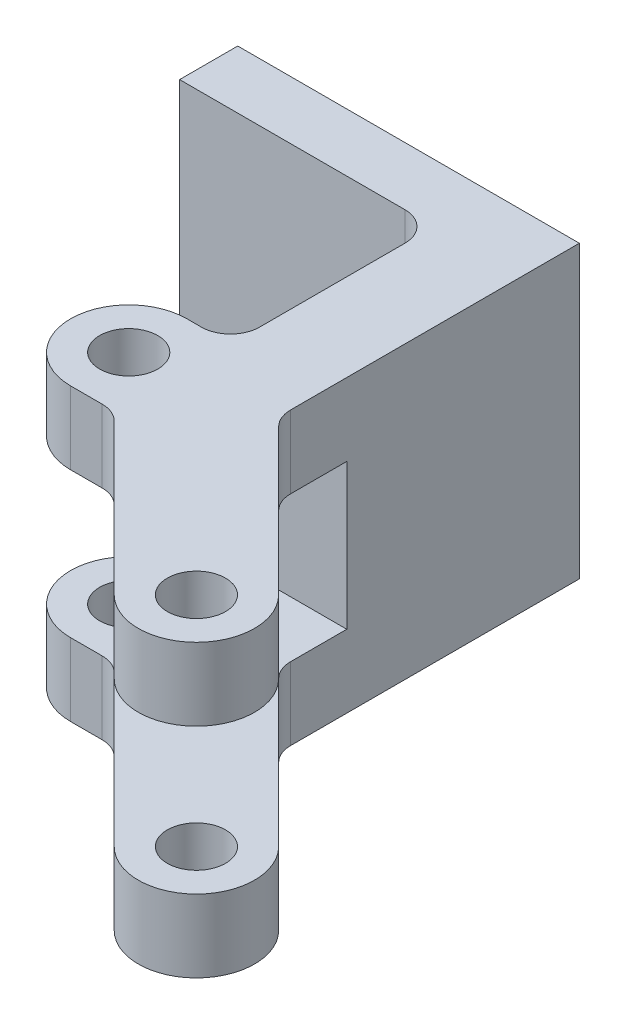
ISO-10303-21;
HEADER;
FILE_DESCRIPTION(('STEP AP214'),'2;1');
FILE_NAME('part.step','',(''),(''),'','','');
FILE_SCHEMA(('AUTOMOTIVE_DESIGN { 1 0 10303 214 1 1 1 1 }'));
ENDSEC;
DATA;
#1=APPLICATION_CONTEXT('core data for automotive mechanical design processes');
#2=APPLICATION_PROTOCOL_DEFINITION('international standard','automotive_design',2000,#1);
#3=PRODUCT_CONTEXT('',#1,'mechanical');
#4=PRODUCT('Part','Part','',(#3));
#5=PRODUCT_RELATED_PRODUCT_CATEGORY('part','',(#4));
#6=PRODUCT_DEFINITION_FORMATION('','',#4);
#7=PRODUCT_DEFINITION_CONTEXT('part definition',#1,'design');
#8=PRODUCT_DEFINITION('design','',#6,#7);
#9=PRODUCT_DEFINITION_SHAPE('','',#8);
#10=(LENGTH_UNIT() NAMED_UNIT(*) SI_UNIT(.MILLI.,.METRE.));
#11=(NAMED_UNIT(*) PLANE_ANGLE_UNIT() SI_UNIT($,.RADIAN.));
#12=(NAMED_UNIT(*) SI_UNIT($,.STERADIAN.) SOLID_ANGLE_UNIT());
#13=UNCERTAINTY_MEASURE_WITH_UNIT(LENGTH_MEASURE(1.E-05),#10,'distance_accuracy_value','');
#14=(GEOMETRIC_REPRESENTATION_CONTEXT(3) GLOBAL_UNCERTAINTY_ASSIGNED_CONTEXT((#13)) GLOBAL_UNIT_ASSIGNED_CONTEXT((#10,
#11,#12)) REPRESENTATION_CONTEXT('',''));
#15=CARTESIAN_POINT('',(0.,0.,0.));
#16=DIRECTION('',(0.,0.,1.));
#17=DIRECTION('',(1.,0.,0.));
#18=AXIS2_PLACEMENT_3D('',#15,#16,#17);
#19=CARTESIAN_POINT('',(0.,10.,4.));
#20=DIRECTION('',(1.,0.,0.));
#21=DIRECTION('',(0.,0.,-1.));
#22=AXIS2_PLACEMENT_3D('',#19,#20,#21);
#23=PLANE('',#22);
#24=DIRECTION('',(0.,0.,1.));
#25=VECTOR('',#24,1.);
#26=CARTESIAN_POINT('',(0.,-10.,4.));
#27=LINE('',#26,#25);
#28=CARTESIAN_POINT('',(0.,-10.,-16.));
#29=VERTEX_POINT('',#28);
#30=CARTESIAN_POINT('',(0.,-10.,-6.));
#31=VERTEX_POINT('',#30);
#32=EDGE_CURVE('E213',#29,#31,#27,.T.);
#33=ORIENTED_EDGE('',*,*,#32,.T.);
#34=DIRECTION('',(0.,-1.,0.));
#35=VECTOR('',#34,1.);
#36=CARTESIAN_POINT('',(0.,-5.,-6.));
#37=LINE('',#36,#35);
#38=CARTESIAN_POINT('',(0.,-5.,-6.));
#39=VERTEX_POINT('',#38);
#40=EDGE_CURVE('E208',#31,#39,#37,.F.);
#41=ORIENTED_EDGE('',*,*,#40,.T.);
#42=DIRECTION('',(0.,1.,0.));
#43=VECTOR('',#42,1.);
#44=CARTESIAN_POINT('',(0.,10.,-6.));
#45=LINE('',#44,#43);
#46=CARTESIAN_POINT('',(0.,5.,-6.));
#47=VERTEX_POINT('',#46);
#48=EDGE_CURVE('E210',#39,#47,#45,.T.);
#49=ORIENTED_EDGE('',*,*,#48,.T.);
#50=DIRECTION('',(0.,-1.,0.));
#51=VECTOR('',#50,1.);
#52=CARTESIAN_POINT('',(0.,10.,-6.));
#53=LINE('',#52,#51);
#54=CARTESIAN_POINT('',(0.,10.,-6.));
#55=VERTEX_POINT('',#54);
#56=EDGE_CURVE('E217',#47,#55,#53,.F.);
#57=ORIENTED_EDGE('',*,*,#56,.T.);
#58=DIRECTION('',(0.,0.,1.));
#59=VECTOR('',#58,1.);
#60=CARTESIAN_POINT('',(0.,10.,4.));
#61=LINE('',#60,#59);
#62=CARTESIAN_POINT('',(0.,10.,-16.));
#63=VERTEX_POINT('',#62);
#64=EDGE_CURVE('E335',#63,#55,#61,.T.);
#65=ORIENTED_EDGE('',*,*,#64,.F.);
#66=DIRECTION('',(0.,-1.,0.));
#67=VECTOR('',#66,1.);
#68=CARTESIAN_POINT('',(0.,-10.,-16.));
#69=LINE('',#68,#67);
#70=EDGE_CURVE('E313',#63,#29,#69,.T.);
#71=ORIENTED_EDGE('',*,*,#70,.T.);
#72=EDGE_LOOP('',(#33,#41,#49,#57,#65,#71));
#73=FACE_BOUND('',#72,.T.);
#74=ADVANCED_FACE('F34',(#73),#23,.F.);
#75=CARTESIAN_POINT('',(0.,10.,4.));
#76=DIRECTION('',(0.,0.,-1.));
#77=DIRECTION('',(-1.,0.,0.));
#78=AXIS2_PLACEMENT_3D('',#75,#76,#77);
#79=PLANE('',#78);
#80=DIRECTION('',(-1.,0.,0.));
#81=VECTOR('',#80,1.);
#82=CARTESIAN_POINT('',(0.,5.,4.));
#83=LINE('',#82,#81);
#84=CARTESIAN_POINT('',(-0.82842712474619,5.,4.));
#85=VERTEX_POINT('',#84);
#86=CARTESIAN_POINT('',(-3.,5.,4.));
#87=VERTEX_POINT('',#86);
#88=EDGE_CURVE('E273',#85,#87,#83,.T.);
#89=ORIENTED_EDGE('',*,*,#88,.F.);
#90=DIRECTION('',(0.,1.,0.));
#91=VECTOR('',#90,1.);
#92=CARTESIAN_POINT('',(-0.82842712474619,10.,4.));
#93=LINE('',#92,#91);
#94=CARTESIAN_POINT('',(-0.82842712474619,10.,4.));
#95=VERTEX_POINT('',#94);
#96=EDGE_CURVE('E284',#85,#95,#93,.T.);
#97=ORIENTED_EDGE('',*,*,#96,.T.);
#98=DIRECTION('',(1.,0.,0.));
#99=VECTOR('',#98,1.);
#100=CARTESIAN_POINT('',(0.,10.,4.));
#101=LINE('',#100,#99);
#102=CARTESIAN_POINT('',(-3.,10.,4.));
#103=VERTEX_POINT('',#102);
#104=EDGE_CURVE('E337',#103,#95,#101,.T.);
#105=ORIENTED_EDGE('',*,*,#104,.F.);
#106=DIRECTION('',(0.,-1.,0.));
#107=VECTOR('',#106,1.);
#108=CARTESIAN_POINT('',(-3.,10.,4.));
#109=LINE('',#108,#107);
#110=EDGE_CURVE('E287',#103,#87,#109,.T.);
#111=ORIENTED_EDGE('',*,*,#110,.T.);
#112=EDGE_LOOP('',(#89,#97,#105,#111));
#113=FACE_BOUND('',#112,.T.);
#114=ADVANCED_FACE('F283',(#113),#79,.F.);
#115=DIRECTION('',(1.,0.,0.));
#116=VECTOR('',#115,1.);
#117=CARTESIAN_POINT('',(0.,-10.,4.));
#118=LINE('',#117,#116);
#119=CARTESIAN_POINT('',(-3.,-10.,4.));
#120=VERTEX_POINT('',#119);
#121=CARTESIAN_POINT('',(-0.82842712474619,-10.,4.));
#122=VERTEX_POINT('',#121);
#123=EDGE_CURVE('E346',#120,#122,#118,.T.);
#124=ORIENTED_EDGE('',*,*,#123,.T.);
#125=DIRECTION('',(0.,1.,0.));
#126=VECTOR('',#125,1.);
#127=CARTESIAN_POINT('',(-0.82842712474619,10.,4.));
#128=LINE('',#127,#126);
#129=CARTESIAN_POINT('',(-0.82842712474619,-5.,4.));
#130=VERTEX_POINT('',#129);
#131=EDGE_CURVE('E295',#122,#130,#128,.T.);
#132=ORIENTED_EDGE('',*,*,#131,.T.);
#133=DIRECTION('',(1.,0.,0.));
#134=VECTOR('',#133,1.);
#135=CARTESIAN_POINT('',(0.,-5.,4.));
#136=LINE('',#135,#134);
#137=CARTESIAN_POINT('',(-3.,-5.,4.));
#138=VERTEX_POINT('',#137);
#139=EDGE_CURVE('E430',#138,#130,#136,.T.);
#140=ORIENTED_EDGE('',*,*,#139,.F.);
#141=EDGE_CURVE('E361',#138,#120,#109,.T.);
#142=ORIENTED_EDGE('',*,*,#141,.T.);
#143=EDGE_LOOP('',(#124,#132,#140,#142));
#144=FACE_BOUND('',#143,.T.);
#145=ADVANCED_FACE('F492',(#144),#79,.F.);
#146=CARTESIAN_POINT('',(6.,10.,-22.));
#147=DIRECTION('',(-1.,0.,0.));
#148=DIRECTION('',(0.,0.,1.));
#149=AXIS2_PLACEMENT_3D('',#146,#147,#148);
#150=PLANE('',#149);
#151=DIRECTION('',(0.,0.,-1.));
#152=VECTOR('',#151,1.);
#153=CARTESIAN_POINT('',(6.,10.,-22.));
#154=LINE('',#153,#152);
#155=CARTESIAN_POINT('',(6.,10.,-2.14213562373096));
#156=VERTEX_POINT('',#155);
#157=CARTESIAN_POINT('',(6.,10.,-22.));
#158=VERTEX_POINT('',#157);
#159=EDGE_CURVE('E357',#156,#158,#154,.T.);
#160=ORIENTED_EDGE('',*,*,#159,.F.);
#161=DIRECTION('',(0.,1.,0.));
#162=VECTOR('',#161,1.);
#163=CARTESIAN_POINT('',(6.,10.,-2.14213562373095));
#164=LINE('',#163,#162);
#165=CARTESIAN_POINT('',(6.,5.,-2.14213562373095));
#166=VERTEX_POINT('',#165);
#167=EDGE_CURVE('E303',#156,#166,#164,.F.);
#168=ORIENTED_EDGE('',*,*,#167,.T.);
#169=DIRECTION('',(0.,0.,1.));
#170=VECTOR('',#169,1.);
#171=CARTESIAN_POINT('',(6.,5.,-22.));
#172=LINE('',#171,#170);
#173=CARTESIAN_POINT('',(6.,5.,-6.));
#174=VERTEX_POINT('',#173);
#175=EDGE_CURVE('E418',#174,#166,#172,.T.);
#176=ORIENTED_EDGE('',*,*,#175,.F.);
#177=DIRECTION('',(0.,-1.,0.));
#178=VECTOR('',#177,1.);
#179=CARTESIAN_POINT('',(6.,10.,-6.));
#180=LINE('',#179,#178);
#181=CARTESIAN_POINT('',(6.,-5.,-6.));
#182=VERTEX_POINT('',#181);
#183=EDGE_CURVE('E316',#174,#182,#180,.T.);
#184=ORIENTED_EDGE('',*,*,#183,.T.);
#185=DIRECTION('',(0.,0.,-1.));
#186=VECTOR('',#185,1.);
#187=CARTESIAN_POINT('',(6.,-5.,-22.));
#188=LINE('',#187,#186);
#189=CARTESIAN_POINT('',(6.,-5.,-2.14213562373095));
#190=VERTEX_POINT('',#189);
#191=EDGE_CURVE('E236',#190,#182,#188,.T.);
#192=ORIENTED_EDGE('',*,*,#191,.F.);
#193=DIRECTION('',(0.,1.,0.));
#194=VECTOR('',#193,1.);
#195=CARTESIAN_POINT('',(6.,10.,-2.14213562373095));
#196=LINE('',#195,#194);
#197=CARTESIAN_POINT('',(6.,-10.,-2.14213562373096));
#198=VERTEX_POINT('',#197);
#199=EDGE_CURVE('E305',#190,#198,#196,.F.);
#200=ORIENTED_EDGE('',*,*,#199,.T.);
#201=DIRECTION('',(0.,0.,-1.));
#202=VECTOR('',#201,1.);
#203=CARTESIAN_POINT('',(6.,-10.,-22.));
#204=LINE('',#203,#202);
#205=CARTESIAN_POINT('',(6.,-10.,-22.));
#206=VERTEX_POINT('',#205);
#207=EDGE_CURVE('E344',#198,#206,#204,.T.);
#208=ORIENTED_EDGE('',*,*,#207,.T.);
#209=DIRECTION('',(0.,-1.,0.));
#210=VECTOR('',#209,1.);
#211=CARTESIAN_POINT('',(6.,10.,-22.));
#212=LINE('',#211,#210);
#213=EDGE_CURVE('E318',#158,#206,#212,.T.);
#214=ORIENTED_EDGE('',*,*,#213,.F.);
#215=EDGE_LOOP('',(#160,#168,#176,#184,#192,#200,#208,#214));
#216=FACE_BOUND('',#215,.T.);
#217=ADVANCED_FACE('F462',(#216),#150,.F.);
#218=CARTESIAN_POINT('',(-3.,10.,0.));
#219=DIRECTION('',(0.,-1.,0.));
#220=DIRECTION('',(0.,0.,-1.));
#221=AXIS2_PLACEMENT_3D('',#218,#219,#220);
#222=CYLINDRICAL_SURFACE('',#221,4.);
#223=CARTESIAN_POINT('',(-3.,5.,0.));
#224=DIRECTION('',(0.,-1.,0.));
#225=DIRECTION('',(1.,0.,0.));
#226=AXIS2_PLACEMENT_3D('',#223,#224,#225);
#227=CIRCLE('',#226,4.);
#228=CARTESIAN_POINT('',(-3.,5.,-4.));
#229=VERTEX_POINT('',#228);
#230=EDGE_CURVE('E288',#87,#229,#227,.T.);
#231=ORIENTED_EDGE('',*,*,#230,.F.);
#232=ORIENTED_EDGE('',*,*,#110,.F.);
#233=CARTESIAN_POINT('',(-3.,10.,0.));
#234=DIRECTION('',(0.,1.,0.));
#235=DIRECTION('',(0.,0.,1.));
#236=AXIS2_PLACEMENT_3D('',#233,#234,#235);
#237=CIRCLE('',#236,4.);
#238=CARTESIAN_POINT('',(-3.,10.,-4.));
#239=VERTEX_POINT('',#238);
#240=EDGE_CURVE('E368',#239,#103,#237,.T.);
#241=ORIENTED_EDGE('',*,*,#240,.F.);
#242=DIRECTION('',(0.,-1.,0.));
#243=VECTOR('',#242,1.);
#244=CARTESIAN_POINT('',(-3.,10.,-4.));
#245=LINE('',#244,#243);
#246=EDGE_CURVE('E362',#239,#229,#245,.T.);
#247=ORIENTED_EDGE('',*,*,#246,.T.);
#248=EDGE_LOOP('',(#231,#232,#241,#247));
#249=FACE_BOUND('',#248,.T.);
#250=ADVANCED_FACE('F510',(#249),#222,.T.);
#251=CARTESIAN_POINT('',(-3.,-5.,0.));
#252=DIRECTION('',(0.,1.,0.));
#253=DIRECTION('',(-1.,0.,0.));
#254=AXIS2_PLACEMENT_3D('',#251,#252,#253);
#255=CIRCLE('',#254,4.);
#256=CARTESIAN_POINT('',(-3.,-5.,-4.));
#257=VERTEX_POINT('',#256);
#258=EDGE_CURVE('E428',#257,#138,#255,.T.);
#259=ORIENTED_EDGE('',*,*,#258,.F.);
#260=CARTESIAN_POINT('',(-3.,-10.,-4.));
#261=VERTEX_POINT('',#260);
#262=EDGE_CURVE('E365',#257,#261,#245,.T.);
#263=ORIENTED_EDGE('',*,*,#262,.T.);
#264=CARTESIAN_POINT('',(-3.,-10.,0.));
#265=DIRECTION('',(0.,1.,0.));
#266=DIRECTION('',(0.,0.,1.));
#267=AXIS2_PLACEMENT_3D('',#264,#265,#266);
#268=CIRCLE('',#267,4.);
#269=EDGE_CURVE('E369',#261,#120,#268,.T.);
#270=ORIENTED_EDGE('',*,*,#269,.T.);
#271=ORIENTED_EDGE('',*,*,#141,.F.);
#272=EDGE_LOOP('',(#259,#263,#270,#271));
#273=FACE_BOUND('',#272,.T.);
#274=ADVANCED_FACE('F535',(#273),#222,.T.);
#275=CARTESIAN_POINT('',(-3.,10.,-4.));
#276=DIRECTION('',(0.,0.,1.));
#277=DIRECTION('',(1.,0.,0.));
#278=AXIS2_PLACEMENT_3D('',#275,#276,#277);
#279=PLANE('',#278);
#280=DIRECTION('',(-1.,0.,0.));
#281=VECTOR('',#280,1.);
#282=CARTESIAN_POINT('',(-3.,10.,-4.));
#283=LINE('',#282,#281);
#284=CARTESIAN_POINT('',(-2.,10.,-4.));
#285=VERTEX_POINT('',#284);
#286=EDGE_CURVE('E373',#285,#239,#283,.T.);
#287=ORIENTED_EDGE('',*,*,#286,.F.);
#288=DIRECTION('',(0.,-1.,0.));
#289=VECTOR('',#288,1.);
#290=CARTESIAN_POINT('',(-2.,5.,-4.));
#291=LINE('',#290,#289);
#292=CARTESIAN_POINT('',(-2.,5.,-4.));
#293=VERTEX_POINT('',#292);
#294=EDGE_CURVE('E216',#285,#293,#291,.T.);
#295=ORIENTED_EDGE('',*,*,#294,.T.);
#296=DIRECTION('',(1.,0.,0.));
#297=VECTOR('',#296,1.);
#298=CARTESIAN_POINT('',(-3.,5.,-4.));
#299=LINE('',#298,#297);
#300=EDGE_CURVE('E413',#229,#293,#299,.T.);
#301=ORIENTED_EDGE('',*,*,#300,.F.);
#302=ORIENTED_EDGE('',*,*,#246,.F.);
#303=EDGE_LOOP('',(#287,#295,#301,#302));
#304=FACE_BOUND('',#303,.T.);
#305=ADVANCED_FACE('F472',(#304),#279,.F.);
#306=DIRECTION('',(-1.,0.,0.));
#307=VECTOR('',#306,1.);
#308=CARTESIAN_POINT('',(-3.,-5.,-4.));
#309=LINE('',#308,#307);
#310=CARTESIAN_POINT('',(-2.,-5.,-4.));
#311=VERTEX_POINT('',#310);
#312=EDGE_CURVE('E426',#311,#257,#309,.T.);
#313=ORIENTED_EDGE('',*,*,#312,.F.);
#314=DIRECTION('',(0.,-1.,0.));
#315=VECTOR('',#314,1.);
#316=CARTESIAN_POINT('',(-2.,-10.,-4.));
#317=LINE('',#316,#315);
#318=CARTESIAN_POINT('',(-2.,-10.,-4.));
#319=VERTEX_POINT('',#318);
#320=EDGE_CURVE('E242',#311,#319,#317,.T.);
#321=ORIENTED_EDGE('',*,*,#320,.T.);
#322=DIRECTION('',(-1.,0.,0.));
#323=VECTOR('',#322,1.);
#324=CARTESIAN_POINT('',(-3.,-10.,-4.));
#325=LINE('',#324,#323);
#326=EDGE_CURVE('E366',#319,#261,#325,.T.);
#327=ORIENTED_EDGE('',*,*,#326,.T.);
#328=ORIENTED_EDGE('',*,*,#262,.F.);
#329=EDGE_LOOP('',(#313,#321,#327,#328));
#330=FACE_BOUND('',#329,.T.);
#331=ADVANCED_FACE('F540',(#330),#279,.F.);
#332=CARTESIAN_POINT('',(-3.,10.,0.));
#333=DIRECTION('',(0.,-1.,0.));
#334=DIRECTION('',(0.,0.,-1.));
#335=AXIS2_PLACEMENT_3D('',#332,#333,#334);
#336=CYLINDRICAL_SURFACE('',#335,2.);
#337=CARTESIAN_POINT('',(-3.,10.,0.));
#338=DIRECTION('',(0.,1.,0.));
#339=DIRECTION('',(0.,0.,1.));
#340=AXIS2_PLACEMENT_3D('',#337,#338,#339);
#341=CIRCLE('',#340,2.);
#342=CARTESIAN_POINT('',(-3.,10.,2.));
#343=VERTEX_POINT('',#342);
#344=EDGE_CURVE('E372',#343,#343,#341,.T.);
#345=ORIENTED_EDGE('',*,*,#344,.T.);
#346=EDGE_LOOP('',(#345));
#347=FACE_BOUND('',#346,.T.);
#348=CARTESIAN_POINT('',(-3.,5.,0.));
#349=DIRECTION('',(0.,-1.,0.));
#350=DIRECTION('',(1.,0.,0.));
#351=AXIS2_PLACEMENT_3D('',#348,#349,#350);
#352=CIRCLE('',#351,2.);
#353=CARTESIAN_POINT('',(-0.999999999999999,5.,0.));
#354=VERTEX_POINT('',#353);
#355=EDGE_CURVE('E229',#354,#354,#352,.T.);
#356=ORIENTED_EDGE('',*,*,#355,.T.);
#357=EDGE_LOOP('',(#356));
#358=FACE_BOUND('',#357,.T.);
#359=ADVANCED_FACE('F557',(#347,#358),#336,.F.);
#360=CARTESIAN_POINT('',(-3.,-10.,0.));
#361=DIRECTION('',(0.,1.,0.));
#362=DIRECTION('',(0.,0.,1.));
#363=AXIS2_PLACEMENT_3D('',#360,#361,#362);
#364=CIRCLE('',#363,2.);
#365=CARTESIAN_POINT('',(-3.,-10.,2.));
#366=VERTEX_POINT('',#365);
#367=EDGE_CURVE('E377',#366,#366,#364,.T.);
#368=ORIENTED_EDGE('',*,*,#367,.F.);
#369=EDGE_LOOP('',(#368));
#370=FACE_BOUND('',#369,.T.);
#371=CARTESIAN_POINT('',(-3.,-5.,0.));
#372=DIRECTION('',(0.,1.,0.));
#373=DIRECTION('',(-1.,0.,0.));
#374=AXIS2_PLACEMENT_3D('',#371,#372,#373);
#375=CIRCLE('',#374,2.);
#376=CARTESIAN_POINT('',(-5.,-5.,0.));
#377=VERTEX_POINT('',#376);
#378=EDGE_CURVE('E323',#377,#377,#375,.T.);
#379=ORIENTED_EDGE('',*,*,#378,.T.);
#380=EDGE_LOOP('',(#379));
#381=FACE_BOUND('',#380,.T.);
#382=ADVANCED_FACE('F553',(#370,#381),#336,.F.);
#383=CARTESIAN_POINT('',(0.,-34.9006771514631,4.));
#384=DIRECTION('',(-0.707106781186548,0.,0.707106781186546));
#385=DIRECTION('',(0.707106781186546,0.,0.707106781186549));
#386=AXIS2_PLACEMENT_3D('',#383,#384,#385);
#387=PLANE('',#386);
#388=DIRECTION('',(0.707106781186546,0.,0.707106781186549));
#389=VECTOR('',#388,1.);
#390=CARTESIAN_POINT('',(0.,10.,4.));
#391=LINE('',#390,#389);
#392=CARTESIAN_POINT('',(0.585786437626906,10.,4.58578643762691));
#393=VERTEX_POINT('',#392);
#394=CARTESIAN_POINT('',(10.9497474683058,10.,14.9497474683058));
#395=VERTEX_POINT('',#394);
#396=EDGE_CURVE('E399',#393,#395,#391,.T.);
#397=ORIENTED_EDGE('',*,*,#396,.F.);
#398=DIRECTION('',(0.,1.,0.));
#399=VECTOR('',#398,1.);
#400=CARTESIAN_POINT('',(0.585786437626907,-34.9006771514631,4.58578643762691));
#401=LINE('',#400,#399);
#402=CARTESIAN_POINT('',(0.585786437626907,5.,4.58578643762691));
#403=VERTEX_POINT('',#402);
#404=EDGE_CURVE('E291',#393,#403,#401,.F.);
#405=ORIENTED_EDGE('',*,*,#404,.T.);
#406=DIRECTION('',(0.707106781186546,0.,0.707106781186549));
#407=VECTOR('',#406,1.);
#408=CARTESIAN_POINT('',(0.,5.,4.));
#409=LINE('',#408,#407);
#410=CARTESIAN_POINT('',(10.9497474683058,5.,14.9497474683058));
#411=VERTEX_POINT('',#410);
#412=EDGE_CURVE('E276',#403,#411,#409,.T.);
#413=ORIENTED_EDGE('',*,*,#412,.T.);
#414=DIRECTION('',(0.,1.,0.));
#415=VECTOR('',#414,1.);
#416=CARTESIAN_POINT('',(10.9497474683058,-34.9006771514631,14.9497474683058));
#417=LINE('',#416,#415);
#418=EDGE_CURVE('E387',#411,#395,#417,.T.);
#419=ORIENTED_EDGE('',*,*,#418,.T.);
#420=EDGE_LOOP('',(#397,#405,#413,#419));
#421=FACE_BOUND('',#420,.T.);
#422=ADVANCED_FACE('F545',(#421),#387,.T.);
#423=DIRECTION('',(-0.707106781186546,0.,-0.707106781186549));
#424=VECTOR('',#423,1.);
#425=CARTESIAN_POINT('',(0.,-5.,4.));
#426=LINE('',#425,#424);
#427=CARTESIAN_POINT('',(10.9497474683058,-5.,14.9497474683058));
#428=VERTEX_POINT('',#427);
#429=CARTESIAN_POINT('',(0.585786437626907,-5.,4.58578643762691));
#430=VERTEX_POINT('',#429);
#431=EDGE_CURVE('E434',#428,#430,#426,.T.);
#432=ORIENTED_EDGE('',*,*,#431,.T.);
#433=DIRECTION('',(0.,1.,0.));
#434=VECTOR('',#433,1.);
#435=CARTESIAN_POINT('',(0.585786437626907,-34.9006771514631,4.58578643762691));
#436=LINE('',#435,#434);
#437=CARTESIAN_POINT('',(0.585786437626907,-10.,4.58578643762691));
#438=VERTEX_POINT('',#437);
#439=EDGE_CURVE('E292',#430,#438,#436,.F.);
#440=ORIENTED_EDGE('',*,*,#439,.T.);
#441=DIRECTION('',(0.707106781186546,0.,0.707106781186549));
#442=VECTOR('',#441,1.);
#443=CARTESIAN_POINT('',(0.,-10.,4.));
#444=LINE('',#443,#442);
#445=CARTESIAN_POINT('',(10.9497474683058,-10.,14.9497474683058));
#446=VERTEX_POINT('',#445);
#447=EDGE_CURVE('E396',#438,#446,#444,.T.);
#448=ORIENTED_EDGE('',*,*,#447,.T.);
#449=EDGE_CURVE('E383',#446,#428,#417,.T.);
#450=ORIENTED_EDGE('',*,*,#449,.T.);
#451=EDGE_LOOP('',(#432,#440,#448,#450));
#452=FACE_BOUND('',#451,.T.);
#453=ADVANCED_FACE('F542',(#452),#387,.T.);
#454=CARTESIAN_POINT('',(13.778174593052,-34.9006771514631,12.1213203435596));
#455=DIRECTION('',(0.,1.,0.));
#456=DIRECTION('',(0.,0.,1.));
#457=AXIS2_PLACEMENT_3D('',#454,#455,#456);
#458=CYLINDRICAL_SURFACE('',#457,4.00000000000002);
#459=CARTESIAN_POINT('',(13.778174593052,5.,12.1213203435596));
#460=DIRECTION('',(0.,-1.,0.));
#461=DIRECTION('',(1.,0.,0.));
#462=AXIS2_PLACEMENT_3D('',#459,#460,#461);
#463=CIRCLE('',#462,4.00000000000002);
#464=CARTESIAN_POINT('',(16.6066017177982,5.,9.29289321881344));
#465=VERTEX_POINT('',#464);
#466=EDGE_CURVE('E417',#411,#465,#463,.F.);
#467=ORIENTED_EDGE('',*,*,#466,.T.);
#468=DIRECTION('',(0.,1.,0.));
#469=VECTOR('',#468,1.);
#470=CARTESIAN_POINT('',(16.6066017177982,-34.9006771514631,9.29289321881344));
#471=LINE('',#470,#469);
#472=CARTESIAN_POINT('',(16.6066017177982,10.,9.29289321881344));
#473=VERTEX_POINT('',#472);
#474=EDGE_CURVE('E391',#465,#473,#471,.T.);
#475=ORIENTED_EDGE('',*,*,#474,.T.);
#476=CARTESIAN_POINT('',(13.778174593052,10.,12.1213203435596));
#477=DIRECTION('',(0.,1.,0.));
#478=DIRECTION('',(0.,0.,1.));
#479=AXIS2_PLACEMENT_3D('',#476,#477,#478);
#480=CIRCLE('',#479,4.00000000000002);
#481=EDGE_CURVE('E401',#395,#473,#480,.T.);
#482=ORIENTED_EDGE('',*,*,#481,.F.);
#483=ORIENTED_EDGE('',*,*,#418,.F.);
#484=EDGE_LOOP('',(#467,#475,#482,#483));
#485=FACE_BOUND('',#484,.T.);
#486=ADVANCED_FACE('F544',(#485),#458,.T.);
#487=CARTESIAN_POINT('',(13.778174593052,-5.,12.1213203435596));
#488=DIRECTION('',(0.,1.,0.));
#489=DIRECTION('',(-1.,0.,0.));
#490=AXIS2_PLACEMENT_3D('',#487,#488,#489);
#491=CIRCLE('',#490,4.00000000000002);
#492=CARTESIAN_POINT('',(16.6066017177982,-5.,9.29289321881344));
#493=VERTEX_POINT('',#492);
#494=EDGE_CURVE('E437',#493,#428,#491,.F.);
#495=ORIENTED_EDGE('',*,*,#494,.T.);
#496=ORIENTED_EDGE('',*,*,#449,.F.);
#497=CARTESIAN_POINT('',(13.778174593052,-10.,12.1213203435596));
#498=DIRECTION('',(0.,-1.,0.));
#499=DIRECTION('',(0.,0.,-1.));
#500=AXIS2_PLACEMENT_3D('',#497,#498,#499);
#501=CIRCLE('',#500,4.00000000000002);
#502=CARTESIAN_POINT('',(16.6066017177982,-10.,9.29289321881344));
#503=VERTEX_POINT('',#502);
#504=EDGE_CURVE('E386',#446,#503,#501,.F.);
#505=ORIENTED_EDGE('',*,*,#504,.T.);
#506=EDGE_CURVE('E388',#503,#493,#471,.T.);
#507=ORIENTED_EDGE('',*,*,#506,.T.);
#508=EDGE_LOOP('',(#495,#496,#505,#507));
#509=FACE_BOUND('',#508,.T.);
#510=ADVANCED_FACE('F449',(#509),#458,.T.);
#511=CARTESIAN_POINT('',(16.6066017177982,-34.9006771514631,9.29289321881345));
#512=DIRECTION('',(0.707106781186547,0.,-0.707106781186548));
#513=DIRECTION('',(-0.707106781186548,0.,-0.707106781186547));
#514=AXIS2_PLACEMENT_3D('',#511,#512,#513);
#515=PLANE('',#514);
#516=DIRECTION('',(-0.707106781186548,0.,-0.707106781186547));
#517=VECTOR('',#516,1.);
#518=CARTESIAN_POINT('',(16.6066017177982,5.,9.29289321881345));
#519=LINE('',#518,#517);
#520=CARTESIAN_POINT('',(6.58578643762691,5.,-0.727922061357857));
#521=VERTEX_POINT('',#520);
#522=EDGE_CURVE('E322',#465,#521,#519,.T.);
#523=ORIENTED_EDGE('',*,*,#522,.T.);
#524=DIRECTION('',(0.,1.,0.));
#525=VECTOR('',#524,1.);
#526=CARTESIAN_POINT('',(6.58578643762691,-34.9006771514631,-0.727922061357857));
#527=LINE('',#526,#525);
#528=CARTESIAN_POINT('',(6.58578643762691,10.,-0.727922061357853));
#529=VERTEX_POINT('',#528);
#530=EDGE_CURVE('E307',#521,#529,#527,.T.);
#531=ORIENTED_EDGE('',*,*,#530,.T.);
#532=DIRECTION('',(-0.707106781186548,0.,-0.707106781186547));
#533=VECTOR('',#532,1.);
#534=CARTESIAN_POINT('',(16.6066017177982,10.,9.29289321881345));
#535=LINE('',#534,#533);
#536=EDGE_CURVE('E398',#473,#529,#535,.T.);
#537=ORIENTED_EDGE('',*,*,#536,.F.);
#538=ORIENTED_EDGE('',*,*,#474,.F.);
#539=EDGE_LOOP('',(#523,#531,#537,#538));
#540=FACE_BOUND('',#539,.T.);
#541=ADVANCED_FACE('F590',(#540),#515,.T.);
#542=DIRECTION('',(-0.707106781186548,0.,-0.707106781186547));
#543=VECTOR('',#542,1.);
#544=CARTESIAN_POINT('',(16.6066017177982,-10.,9.29289321881345));
#545=LINE('',#544,#543);
#546=CARTESIAN_POINT('',(6.58578643762691,-10.,-0.727922061357855));
#547=VERTEX_POINT('',#546);
#548=EDGE_CURVE('E380',#503,#547,#545,.T.);
#549=ORIENTED_EDGE('',*,*,#548,.T.);
#550=DIRECTION('',(0.,1.,0.));
#551=VECTOR('',#550,1.);
#552=CARTESIAN_POINT('',(6.58578643762691,-34.9006771514631,-0.727922061357857));
#553=LINE('',#552,#551);
#554=CARTESIAN_POINT('',(6.58578643762691,-5.,-0.727922061357857));
#555=VERTEX_POINT('',#554);
#556=EDGE_CURVE('E300',#547,#555,#553,.T.);
#557=ORIENTED_EDGE('',*,*,#556,.T.);
#558=DIRECTION('',(0.707106781186548,0.,0.707106781186547));
#559=VECTOR('',#558,1.);
#560=CARTESIAN_POINT('',(16.6066017177982,-5.,9.29289321881345));
#561=LINE('',#560,#559);
#562=EDGE_CURVE('E326',#555,#493,#561,.T.);
#563=ORIENTED_EDGE('',*,*,#562,.T.);
#564=ORIENTED_EDGE('',*,*,#506,.F.);
#565=EDGE_LOOP('',(#549,#557,#563,#564));
#566=FACE_BOUND('',#565,.T.);
#567=ADVANCED_FACE('F444',(#566),#515,.T.);
#568=CARTESIAN_POINT('',(13.778174593052,-15.6568542494924,12.1213203435596));
#569=DIRECTION('',(0.,1.,0.));
#570=DIRECTION('',(0.,0.,1.));
#571=AXIS2_PLACEMENT_3D('',#568,#569,#570);
#572=CYLINDRICAL_SURFACE('',#571,2.00000000000001);
#573=CARTESIAN_POINT('',(13.778174593052,10.,12.1213203435596));
#574=DIRECTION('',(0.,1.,0.));
#575=DIRECTION('',(0.,0.,1.));
#576=AXIS2_PLACEMENT_3D('',#573,#574,#575);
#577=CIRCLE('',#576,2.00000000000001);
#578=CARTESIAN_POINT('',(13.778174593052,10.,14.1213203435596));
#579=VERTEX_POINT('',#578);
#580=EDGE_CURVE('E228',#579,#579,#577,.T.);
#581=ORIENTED_EDGE('',*,*,#580,.T.);
#582=EDGE_LOOP('',(#581));
#583=FACE_BOUND('',#582,.T.);
#584=CARTESIAN_POINT('',(13.778174593052,5.,12.1213203435596));
#585=DIRECTION('',(0.,-1.,0.));
#586=DIRECTION('',(1.,0.,0.));
#587=AXIS2_PLACEMENT_3D('',#584,#585,#586);
#588=CIRCLE('',#587,2.00000000000001);
#589=CARTESIAN_POINT('',(15.778174593052,5.,12.1213203435596));
#590=VERTEX_POINT('',#589);
#591=EDGE_CURVE('E319',#590,#590,#588,.F.);
#592=ORIENTED_EDGE('',*,*,#591,.F.);
#593=EDGE_LOOP('',(#592));
#594=FACE_BOUND('',#593,.T.);
#595=ADVANCED_FACE('F573',(#583,#594),#572,.F.);
#596=CARTESIAN_POINT('',(13.778174593052,-10.,12.1213203435596));
#597=DIRECTION('',(0.,-1.,0.));
#598=DIRECTION('',(0.,0.,-1.));
#599=AXIS2_PLACEMENT_3D('',#596,#597,#598);
#600=CIRCLE('',#599,2.00000000000001);
#601=CARTESIAN_POINT('',(13.778174593052,-10.,10.1213203435596));
#602=VERTEX_POINT('',#601);
#603=EDGE_CURVE('E402',#602,#602,#600,.F.);
#604=ORIENTED_EDGE('',*,*,#603,.F.);
#605=EDGE_LOOP('',(#604));
#606=FACE_BOUND('',#605,.T.);
#607=CARTESIAN_POINT('',(13.778174593052,-5.,12.1213203435596));
#608=DIRECTION('',(0.,1.,0.));
#609=DIRECTION('',(-1.,0.,0.));
#610=AXIS2_PLACEMENT_3D('',#607,#608,#609);
#611=CIRCLE('',#610,2.00000000000001);
#612=CARTESIAN_POINT('',(11.778174593052,-5.,12.1213203435596));
#613=VERTEX_POINT('',#612);
#614=EDGE_CURVE('E237',#613,#613,#611,.F.);
#615=ORIENTED_EDGE('',*,*,#614,.F.);
#616=EDGE_LOOP('',(#615));
#617=FACE_BOUND('',#616,.T.);
#618=ADVANCED_FACE('F507',(#606,#617),#572,.F.);
#619=CARTESIAN_POINT('',(-17.5,10.,-22.));
#620=DIRECTION('',(0.,0.,1.));
#621=DIRECTION('',(1.,0.,0.));
#622=AXIS2_PLACEMENT_3D('',#619,#620,#621);
#623=PLANE('',#622);
#624=DIRECTION('',(-1.,0.,0.));
#625=VECTOR('',#624,1.);
#626=CARTESIAN_POINT('',(-17.5,-10.,-22.));
#627=LINE('',#626,#625);
#628=CARTESIAN_POINT('',(-17.5,-10.,-22.));
#629=VERTEX_POINT('',#628);
#630=EDGE_CURVE('E342',#206,#629,#627,.T.);
#631=ORIENTED_EDGE('',*,*,#630,.T.);
#632=DIRECTION('',(0.,-1.,0.));
#633=VECTOR('',#632,1.);
#634=CARTESIAN_POINT('',(-17.5,10.,-22.));
#635=LINE('',#634,#633);
#636=CARTESIAN_POINT('',(-17.5,10.,-22.));
#637=VERTEX_POINT('',#636);
#638=EDGE_CURVE('E329',#637,#629,#635,.T.);
#639=ORIENTED_EDGE('',*,*,#638,.F.);
#640=DIRECTION('',(-1.,0.,0.));
#641=VECTOR('',#640,1.);
#642=CARTESIAN_POINT('',(-17.5,10.,-22.));
#643=LINE('',#642,#641);
#644=EDGE_CURVE('E355',#158,#637,#643,.T.);
#645=ORIENTED_EDGE('',*,*,#644,.F.);
#646=ORIENTED_EDGE('',*,*,#213,.T.);
#647=EDGE_LOOP('',(#631,#639,#645,#646));
#648=FACE_BOUND('',#647,.T.);
#649=ADVANCED_FACE('F503',(#648),#623,.F.);
#650=CARTESIAN_POINT('',(-17.5,10.,-18.));
#651=DIRECTION('',(1.,0.,0.));
#652=DIRECTION('',(0.,0.,-1.));
#653=AXIS2_PLACEMENT_3D('',#650,#651,#652);
#654=PLANE('',#653);
#655=DIRECTION('',(0.,0.,1.));
#656=VECTOR('',#655,1.);
#657=CARTESIAN_POINT('',(-17.5,-10.,-18.));
#658=LINE('',#657,#656);
#659=CARTESIAN_POINT('',(-17.5,-10.,-18.));
#660=VERTEX_POINT('',#659);
#661=EDGE_CURVE('E340',#629,#660,#658,.T.);
#662=ORIENTED_EDGE('',*,*,#661,.T.);
#663=DIRECTION('',(0.,-1.,0.));
#664=VECTOR('',#663,1.);
#665=CARTESIAN_POINT('',(-17.5,10.,-18.));
#666=LINE('',#665,#664);
#667=CARTESIAN_POINT('',(-17.5,10.,-18.));
#668=VERTEX_POINT('',#667);
#669=EDGE_CURVE('E332',#668,#660,#666,.T.);
#670=ORIENTED_EDGE('',*,*,#669,.F.);
#671=DIRECTION('',(0.,0.,1.));
#672=VECTOR('',#671,1.);
#673=CARTESIAN_POINT('',(-17.5,10.,-18.));
#674=LINE('',#673,#672);
#675=EDGE_CURVE('E353',#637,#668,#674,.T.);
#676=ORIENTED_EDGE('',*,*,#675,.F.);
#677=ORIENTED_EDGE('',*,*,#638,.T.);
#678=EDGE_LOOP('',(#662,#670,#676,#677));
#679=FACE_BOUND('',#678,.T.);
#680=ADVANCED_FACE('F500',(#679),#654,.F.);
#681=CARTESIAN_POINT('',(0.,10.,-18.));
#682=DIRECTION('',(0.,0.,-1.));
#683=DIRECTION('',(-1.,0.,0.));
#684=AXIS2_PLACEMENT_3D('',#681,#682,#683);
#685=PLANE('',#684);
#686=DIRECTION('',(1.,0.,0.));
#687=VECTOR('',#686,1.);
#688=CARTESIAN_POINT('',(0.,-10.,-18.));
#689=LINE('',#688,#687);
#690=CARTESIAN_POINT('',(-2.,-10.,-18.));
#691=VERTEX_POINT('',#690);
#692=EDGE_CURVE('E338',#660,#691,#689,.T.);
#693=ORIENTED_EDGE('',*,*,#692,.T.);
#694=DIRECTION('',(0.,-1.,0.));
#695=VECTOR('',#694,1.);
#696=CARTESIAN_POINT('',(-2.,10.,-18.));
#697=LINE('',#696,#695);
#698=CARTESIAN_POINT('',(-2.,10.,-18.));
#699=VERTEX_POINT('',#698);
#700=EDGE_CURVE('E49',#691,#699,#697,.F.);
#701=ORIENTED_EDGE('',*,*,#700,.T.);
#702=DIRECTION('',(1.,0.,0.));
#703=VECTOR('',#702,1.);
#704=CARTESIAN_POINT('',(0.,10.,-18.));
#705=LINE('',#704,#703);
#706=EDGE_CURVE('E351',#668,#699,#705,.T.);
#707=ORIENTED_EDGE('',*,*,#706,.F.);
#708=ORIENTED_EDGE('',*,*,#669,.T.);
#709=EDGE_LOOP('',(#693,#701,#707,#708));
#710=FACE_BOUND('',#709,.T.);
#711=ADVANCED_FACE('F497',(#710),#685,.F.);
#712=CARTESIAN_POINT('',(0.,10.,0.));
#713=DIRECTION('',(0.,-1.,0.));
#714=DIRECTION('',(0.,0.,-1.));
#715=AXIS2_PLACEMENT_3D('',#712,#713,#714);
#716=PLANE('',#715);
#717=ORIENTED_EDGE('',*,*,#580,.F.);
#718=EDGE_LOOP('',(#717));
#719=FACE_BOUND('',#718,.T.);
#720=ORIENTED_EDGE('',*,*,#104,.T.);
#721=CARTESIAN_POINT('',(-0.82842712474619,10.,6.));
#722=DIRECTION('',(0.,-1.,0.));
#723=DIRECTION('',(0.,0.,-1.));
#724=AXIS2_PLACEMENT_3D('',#721,#722,#723);
#725=CIRCLE('',#724,2.);
#726=EDGE_CURVE('E264',#95,#393,#725,.T.);
#727=ORIENTED_EDGE('',*,*,#726,.T.);
#728=ORIENTED_EDGE('',*,*,#396,.T.);
#729=ORIENTED_EDGE('',*,*,#481,.T.);
#730=ORIENTED_EDGE('',*,*,#536,.T.);
#731=CARTESIAN_POINT('',(8.,10.,-2.14213562373095));
#732=DIRECTION('',(0.,-1.,0.));
#733=DIRECTION('',(0.,0.,-1.));
#734=AXIS2_PLACEMENT_3D('',#731,#732,#733);
#735=CIRCLE('',#734,2.);
#736=EDGE_CURVE('E252',#529,#156,#735,.T.);
#737=ORIENTED_EDGE('',*,*,#736,.T.);
#738=ORIENTED_EDGE('',*,*,#159,.T.);
#739=ORIENTED_EDGE('',*,*,#644,.T.);
#740=ORIENTED_EDGE('',*,*,#675,.T.);
#741=ORIENTED_EDGE('',*,*,#706,.T.);
#742=CARTESIAN_POINT('',(-2.,10.,-16.));
#743=DIRECTION('',(0.,-1.,0.));
#744=DIRECTION('',(0.,0.,-1.));
#745=AXIS2_PLACEMENT_3D('',#742,#743,#744);
#746=CIRCLE('',#745,2.);
#747=EDGE_CURVE('E11',#699,#63,#746,.T.);
#748=ORIENTED_EDGE('',*,*,#747,.T.);
#749=ORIENTED_EDGE('',*,*,#64,.T.);
#750=CARTESIAN_POINT('',(-2.,10.,-6.));
#751=DIRECTION('',(0.,-1.,0.));
#752=DIRECTION('',(0.,0.,-1.));
#753=AXIS2_PLACEMENT_3D('',#750,#751,#752);
#754=CIRCLE('',#753,2.);
#755=EDGE_CURVE('E246',#55,#285,#754,.T.);
#756=ORIENTED_EDGE('',*,*,#755,.T.);
#757=ORIENTED_EDGE('',*,*,#286,.T.);
#758=ORIENTED_EDGE('',*,*,#240,.T.);
#759=EDGE_LOOP('',(#720,#727,#728,#729,#730,#737,#738,#739,#740,#741,#748,#749,#756,#757,#758));
#760=FACE_BOUND('',#759,.T.);
#761=ORIENTED_EDGE('',*,*,#344,.F.);
#762=EDGE_LOOP('',(#761));
#763=FACE_BOUND('',#762,.T.);
#764=ADVANCED_FACE('F476',(#719,#760,#763),#716,.F.);
#765=CARTESIAN_POINT('',(0.,-10.,0.));
#766=DIRECTION('',(0.,-1.,0.));
#767=DIRECTION('',(0.,0.,-1.));
#768=AXIS2_PLACEMENT_3D('',#765,#766,#767);
#769=PLANE('',#768);
#770=ORIENTED_EDGE('',*,*,#603,.T.);
#771=EDGE_LOOP('',(#770));
#772=FACE_BOUND('',#771,.T.);
#773=ORIENTED_EDGE('',*,*,#207,.F.);
#774=CARTESIAN_POINT('',(8.,-10.,-2.14213562373095));
#775=DIRECTION('',(0.,-1.,0.));
#776=DIRECTION('',(0.,0.,-1.));
#777=AXIS2_PLACEMENT_3D('',#774,#775,#776);
#778=CIRCLE('',#777,2.);
#779=EDGE_CURVE('E258',#198,#547,#778,.F.);
#780=ORIENTED_EDGE('',*,*,#779,.T.);
#781=ORIENTED_EDGE('',*,*,#548,.F.);
#782=ORIENTED_EDGE('',*,*,#504,.F.);
#783=ORIENTED_EDGE('',*,*,#447,.F.);
#784=CARTESIAN_POINT('',(-0.82842712474619,-10.,6.));
#785=DIRECTION('',(0.,-1.,0.));
#786=DIRECTION('',(0.,0.,-1.));
#787=AXIS2_PLACEMENT_3D('',#784,#785,#786);
#788=CIRCLE('',#787,2.);
#789=EDGE_CURVE('E262',#438,#122,#788,.F.);
#790=ORIENTED_EDGE('',*,*,#789,.T.);
#791=ORIENTED_EDGE('',*,*,#123,.F.);
#792=ORIENTED_EDGE('',*,*,#269,.F.);
#793=ORIENTED_EDGE('',*,*,#326,.F.);
#794=CARTESIAN_POINT('',(-2.,-10.,-6.));
#795=DIRECTION('',(0.,-1.,0.));
#796=DIRECTION('',(0.,0.,-1.));
#797=AXIS2_PLACEMENT_3D('',#794,#795,#796);
#798=CIRCLE('',#797,2.);
#799=EDGE_CURVE('E244',#319,#31,#798,.F.);
#800=ORIENTED_EDGE('',*,*,#799,.T.);
#801=ORIENTED_EDGE('',*,*,#32,.F.);
#802=CARTESIAN_POINT('',(-2.,-10.,-16.));
#803=DIRECTION('',(0.,-1.,0.));
#804=DIRECTION('',(0.,0.,-1.));
#805=AXIS2_PLACEMENT_3D('',#802,#803,#804);
#806=CIRCLE('',#805,2.);
#807=EDGE_CURVE('E42',#29,#691,#806,.F.);
#808=ORIENTED_EDGE('',*,*,#807,.T.);
#809=ORIENTED_EDGE('',*,*,#692,.F.);
#810=ORIENTED_EDGE('',*,*,#661,.F.);
#811=ORIENTED_EDGE('',*,*,#630,.F.);
#812=EDGE_LOOP('',(#773,#780,#781,#782,#783,#790,#791,#792,#793,#800,#801,#808,#809,#810,#811));
#813=FACE_BOUND('',#812,.T.);
#814=ORIENTED_EDGE('',*,*,#367,.T.);
#815=EDGE_LOOP('',(#814));
#816=FACE_BOUND('',#815,.T.);
#817=ADVANCED_FACE('F453',(#772,#813,#816),#769,.T.);
#818=CARTESIAN_POINT('',(0.,0.,-6.));
#819=DIRECTION('',(0.,0.,-1.));
#820=DIRECTION('',(-1.,0.,0.));
#821=AXIS2_PLACEMENT_3D('',#818,#819,#820);
#822=PLANE('',#821);
#823=DIRECTION('',(1.,0.,0.));
#824=VECTOR('',#823,1.);
#825=CARTESIAN_POINT('',(22.5,-5.,-6.));
#826=LINE('',#825,#824);
#827=EDGE_CURVE('E224',#39,#182,#826,.T.);
#828=ORIENTED_EDGE('',*,*,#827,.T.);
#829=ORIENTED_EDGE('',*,*,#183,.F.);
#830=DIRECTION('',(-1.,0.,0.));
#831=VECTOR('',#830,1.);
#832=CARTESIAN_POINT('',(22.5,5.,-6.));
#833=LINE('',#832,#831);
#834=EDGE_CURVE('E227',#174,#47,#833,.T.);
#835=ORIENTED_EDGE('',*,*,#834,.T.);
#836=ORIENTED_EDGE('',*,*,#48,.F.);
#837=EDGE_LOOP('',(#828,#829,#835,#836));
#838=FACE_BOUND('',#837,.T.);
#839=ADVANCED_FACE('F223',(#838),#822,.F.);
#840=CARTESIAN_POINT('',(22.5,5.,16.1213203435597));
#841=DIRECTION('',(0.,-1.,0.));
#842=DIRECTION('',(1.,0.,0.));
#843=AXIS2_PLACEMENT_3D('',#840,#841,#842);
#844=PLANE('',#843);
#845=ORIENTED_EDGE('',*,*,#355,.F.);
#846=EDGE_LOOP('',(#845));
#847=FACE_BOUND('',#846,.T.);
#848=ORIENTED_EDGE('',*,*,#591,.T.);
#849=EDGE_LOOP('',(#848));
#850=FACE_BOUND('',#849,.T.);
#851=ORIENTED_EDGE('',*,*,#300,.T.);
#852=CARTESIAN_POINT('',(-2.,5.,-6.));
#853=DIRECTION('',(0.,-1.,0.));
#854=DIRECTION('',(1.,0.,0.));
#855=AXIS2_PLACEMENT_3D('',#852,#853,#854);
#856=CIRCLE('',#855,2.);
#857=EDGE_CURVE('E243',#293,#47,#856,.F.);
#858=ORIENTED_EDGE('',*,*,#857,.T.);
#859=ORIENTED_EDGE('',*,*,#834,.F.);
#860=ORIENTED_EDGE('',*,*,#175,.T.);
#861=CARTESIAN_POINT('',(8.,5.,-2.14213562373095));
#862=DIRECTION('',(0.,-1.,0.));
#863=DIRECTION('',(1.,0.,0.));
#864=AXIS2_PLACEMENT_3D('',#861,#862,#863);
#865=CIRCLE('',#864,2.);
#866=EDGE_CURVE('E254',#166,#521,#865,.F.);
#867=ORIENTED_EDGE('',*,*,#866,.T.);
#868=ORIENTED_EDGE('',*,*,#522,.F.);
#869=ORIENTED_EDGE('',*,*,#466,.F.);
#870=ORIENTED_EDGE('',*,*,#412,.F.);
#871=CARTESIAN_POINT('',(-0.82842712474619,5.,6.));
#872=DIRECTION('',(0.,-1.,0.));
#873=DIRECTION('',(1.,0.,0.));
#874=AXIS2_PLACEMENT_3D('',#871,#872,#873);
#875=CIRCLE('',#874,2.);
#876=EDGE_CURVE('E266',#403,#85,#875,.F.);
#877=ORIENTED_EDGE('',*,*,#876,.T.);
#878=ORIENTED_EDGE('',*,*,#88,.T.);
#879=ORIENTED_EDGE('',*,*,#230,.T.);
#880=EDGE_LOOP('',(#851,#858,#859,#860,#867,#868,#869,#870,#877,#878,#879));
#881=FACE_BOUND('',#880,.T.);
#882=ADVANCED_FACE('F272',(#847,#850,#881),#844,.T.);
#883=CARTESIAN_POINT('',(22.5,-5.,16.1213203435597));
#884=DIRECTION('',(0.,1.,0.));
#885=DIRECTION('',(-1.,0.,0.));
#886=AXIS2_PLACEMENT_3D('',#883,#884,#885);
#887=PLANE('',#886);
#888=ORIENTED_EDGE('',*,*,#378,.F.);
#889=EDGE_LOOP('',(#888));
#890=FACE_BOUND('',#889,.T.);
#891=ORIENTED_EDGE('',*,*,#614,.T.);
#892=EDGE_LOOP('',(#891));
#893=FACE_BOUND('',#892,.T.);
#894=ORIENTED_EDGE('',*,*,#827,.F.);
#895=CARTESIAN_POINT('',(-2.,-5.,-6.));
#896=DIRECTION('',(0.,1.,0.));
#897=DIRECTION('',(-1.,0.,0.));
#898=AXIS2_PLACEMENT_3D('',#895,#896,#897);
#899=CIRCLE('',#898,2.);
#900=EDGE_CURVE('E233',#39,#311,#899,.F.);
#901=ORIENTED_EDGE('',*,*,#900,.T.);
#902=ORIENTED_EDGE('',*,*,#312,.T.);
#903=ORIENTED_EDGE('',*,*,#258,.T.);
#904=ORIENTED_EDGE('',*,*,#139,.T.);
#905=CARTESIAN_POINT('',(-0.82842712474619,-5.,6.));
#906=DIRECTION('',(0.,1.,0.));
#907=DIRECTION('',(-1.,0.,0.));
#908=AXIS2_PLACEMENT_3D('',#905,#906,#907);
#909=CIRCLE('',#908,2.);
#910=EDGE_CURVE('E260',#130,#430,#909,.F.);
#911=ORIENTED_EDGE('',*,*,#910,.T.);
#912=ORIENTED_EDGE('',*,*,#431,.F.);
#913=ORIENTED_EDGE('',*,*,#494,.F.);
#914=ORIENTED_EDGE('',*,*,#562,.F.);
#915=CARTESIAN_POINT('',(8.,-5.,-2.14213562373095));
#916=DIRECTION('',(0.,1.,0.));
#917=DIRECTION('',(-1.,0.,0.));
#918=AXIS2_PLACEMENT_3D('',#915,#916,#917);
#919=CIRCLE('',#918,2.);
#920=EDGE_CURVE('E256',#555,#190,#919,.F.);
#921=ORIENTED_EDGE('',*,*,#920,.T.);
#922=ORIENTED_EDGE('',*,*,#191,.T.);
#923=EDGE_LOOP('',(#894,#901,#902,#903,#904,#911,#912,#913,#914,#921,#922));
#924=FACE_BOUND('',#923,.T.);
#925=ADVANCED_FACE('F232',(#890,#893,#924),#887,.T.);
#926=CARTESIAN_POINT('',(-2.,10.,-6.));
#927=DIRECTION('',(0.,1.,0.));
#928=DIRECTION('',(0.,0.,1.));
#929=AXIS2_PLACEMENT_3D('',#926,#927,#928);
#930=CYLINDRICAL_SURFACE('',#929,2.);
#931=ORIENTED_EDGE('',*,*,#900,.F.);
#932=ORIENTED_EDGE('',*,*,#40,.F.);
#933=ORIENTED_EDGE('',*,*,#799,.F.);
#934=ORIENTED_EDGE('',*,*,#320,.F.);
#935=EDGE_LOOP('',(#931,#932,#933,#934));
#936=FACE_BOUND('',#935,.T.);
#937=ADVANCED_FACE('F240',(#936),#930,.F.);
#938=CARTESIAN_POINT('',(-2.,10.,-6.));
#939=DIRECTION('',(0.,1.,0.));
#940=DIRECTION('',(0.,0.,1.));
#941=AXIS2_PLACEMENT_3D('',#938,#939,#940);
#942=CYLINDRICAL_SURFACE('',#941,2.);
#943=ORIENTED_EDGE('',*,*,#755,.F.);
#944=ORIENTED_EDGE('',*,*,#56,.F.);
#945=ORIENTED_EDGE('',*,*,#857,.F.);
#946=ORIENTED_EDGE('',*,*,#294,.F.);
#947=EDGE_LOOP('',(#943,#944,#945,#946));
#948=FACE_BOUND('',#947,.T.);
#949=ADVANCED_FACE('F469',(#948),#942,.F.);
#950=CARTESIAN_POINT('',(8.,-34.9006771514631,-2.14213562373095));
#951=DIRECTION('',(0.,1.,0.));
#952=DIRECTION('',(0.,0.,1.));
#953=AXIS2_PLACEMENT_3D('',#950,#951,#952);
#954=CYLINDRICAL_SURFACE('',#953,2.);
#955=ORIENTED_EDGE('',*,*,#866,.F.);
#956=ORIENTED_EDGE('',*,*,#167,.F.);
#957=ORIENTED_EDGE('',*,*,#736,.F.);
#958=ORIENTED_EDGE('',*,*,#530,.F.);
#959=EDGE_LOOP('',(#955,#956,#957,#958));
#960=FACE_BOUND('',#959,.T.);
#961=ADVANCED_FACE('F516',(#960),#954,.F.);
#962=CARTESIAN_POINT('',(8.,-34.9006771514631,-2.14213562373095));
#963=DIRECTION('',(0.,1.,0.));
#964=DIRECTION('',(0.,0.,1.));
#965=AXIS2_PLACEMENT_3D('',#962,#963,#964);
#966=CYLINDRICAL_SURFACE('',#965,2.);
#967=ORIENTED_EDGE('',*,*,#779,.F.);
#968=ORIENTED_EDGE('',*,*,#199,.F.);
#969=ORIENTED_EDGE('',*,*,#920,.F.);
#970=ORIENTED_EDGE('',*,*,#556,.F.);
#971=EDGE_LOOP('',(#967,#968,#969,#970));
#972=FACE_BOUND('',#971,.T.);
#973=ADVANCED_FACE('F458',(#972),#966,.F.);
#974=CARTESIAN_POINT('',(-0.82842712474619,10.,6.));
#975=DIRECTION('',(0.,1.,0.));
#976=DIRECTION('',(0.,0.,1.));
#977=AXIS2_PLACEMENT_3D('',#974,#975,#976);
#978=CYLINDRICAL_SURFACE('',#977,2.);
#979=ORIENTED_EDGE('',*,*,#789,.F.);
#980=ORIENTED_EDGE('',*,*,#439,.F.);
#981=ORIENTED_EDGE('',*,*,#910,.F.);
#982=ORIENTED_EDGE('',*,*,#131,.F.);
#983=EDGE_LOOP('',(#979,#980,#981,#982));
#984=FACE_BOUND('',#983,.T.);
#985=ADVANCED_FACE('F486',(#984),#978,.F.);
#986=CARTESIAN_POINT('',(-0.82842712474619,10.,6.));
#987=DIRECTION('',(0.,1.,0.));
#988=DIRECTION('',(0.,0.,1.));
#989=AXIS2_PLACEMENT_3D('',#986,#987,#988);
#990=CYLINDRICAL_SURFACE('',#989,2.);
#991=ORIENTED_EDGE('',*,*,#876,.F.);
#992=ORIENTED_EDGE('',*,*,#404,.F.);
#993=ORIENTED_EDGE('',*,*,#726,.F.);
#994=ORIENTED_EDGE('',*,*,#96,.F.);
#995=EDGE_LOOP('',(#991,#992,#993,#994));
#996=FACE_BOUND('',#995,.T.);
#997=ADVANCED_FACE('F290',(#996),#990,.F.);
#998=CARTESIAN_POINT('',(-2.,10.,-16.));
#999=DIRECTION('',(0.,1.,0.));
#1000=DIRECTION('',(0.,0.,1.));
#1001=AXIS2_PLACEMENT_3D('',#998,#999,#1000);
#1002=CYLINDRICAL_SURFACE('',#1001,2.);
#1003=ORIENTED_EDGE('',*,*,#747,.F.);
#1004=ORIENTED_EDGE('',*,*,#700,.F.);
#1005=ORIENTED_EDGE('',*,*,#807,.F.);
#1006=ORIENTED_EDGE('',*,*,#70,.F.);
#1007=EDGE_LOOP('',(#1003,#1004,#1005,#1006));
#1008=FACE_BOUND('',#1007,.T.);
#1009=ADVANCED_FACE('F36',(#1008),#1002,.F.);
#1010=CLOSED_SHELL('',(#74,#114,#145,#217,#250,#274,#305,#331,#359,#382,#422,#453,#486,#510,
#541,#567,#595,#618,#649,#680,#711,#764,#817,#839,#882,#925,#937,#949,#961,#973,#985,#997,#1009));
#1011=MANIFOLD_SOLID_BREP('B2',#1010);
#1012=ADVANCED_BREP_SHAPE_REPRESENTATION('',(#18,#1011),#14);
#1013=SHAPE_DEFINITION_REPRESENTATION(#9,#1012);
ENDSEC;
END-ISO-10303-21;
